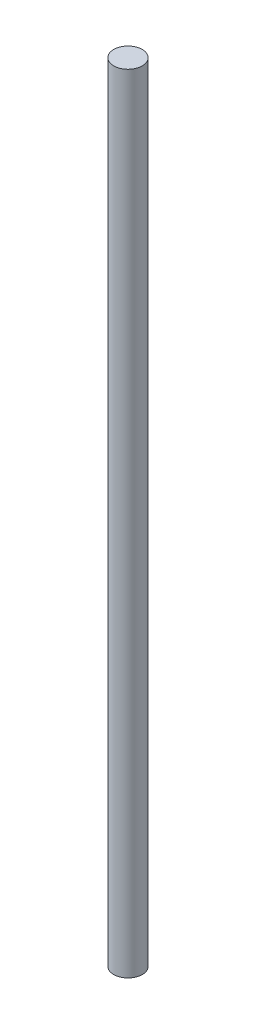
ISO-10303-21;
HEADER;
FILE_DESCRIPTION(('STEP AP214'),'2;1');
FILE_NAME('part.step','',(''),(''),'','','');
FILE_SCHEMA(('AUTOMOTIVE_DESIGN { 1 0 10303 214 1 1 1 1 }'));
ENDSEC;
DATA;
#1=APPLICATION_CONTEXT('core data for automotive mechanical design processes');
#2=APPLICATION_PROTOCOL_DEFINITION('international standard','automotive_design',2000,#1);
#3=PRODUCT_CONTEXT('',#1,'mechanical');
#4=PRODUCT('Part','Part','',(#3));
#5=PRODUCT_RELATED_PRODUCT_CATEGORY('part','',(#4));
#6=PRODUCT_DEFINITION_FORMATION('','',#4);
#7=PRODUCT_DEFINITION_CONTEXT('part definition',#1,'design');
#8=PRODUCT_DEFINITION('design','',#6,#7);
#9=PRODUCT_DEFINITION_SHAPE('','',#8);
#10=(LENGTH_UNIT() NAMED_UNIT(*) SI_UNIT(.MILLI.,.METRE.));
#11=(NAMED_UNIT(*) PLANE_ANGLE_UNIT() SI_UNIT($,.RADIAN.));
#12=(NAMED_UNIT(*) SI_UNIT($,.STERADIAN.) SOLID_ANGLE_UNIT());
#13=UNCERTAINTY_MEASURE_WITH_UNIT(LENGTH_MEASURE(1.E-05),#10,'distance_accuracy_value','');
#14=(GEOMETRIC_REPRESENTATION_CONTEXT(3) GLOBAL_UNCERTAINTY_ASSIGNED_CONTEXT((#13)) GLOBAL_UNIT_ASSIGNED_CONTEXT((#10,
#11,#12)) REPRESENTATION_CONTEXT('',''));
#15=CARTESIAN_POINT('',(0.,0.,0.));
#16=DIRECTION('',(0.,0.,1.));
#17=DIRECTION('',(1.,0.,0.));
#18=AXIS2_PLACEMENT_3D('',#15,#16,#17);
#19=CARTESIAN_POINT('',(0.,87.63,0.));
#20=DIRECTION('',(0.,-1.,0.));
#21=DIRECTION('',(0.,0.,-1.));
#22=AXIS2_PLACEMENT_3D('',#19,#20,#21);
#23=CYLINDRICAL_SURFACE('',#22,1.5875);
#24=CARTESIAN_POINT('',(0.,87.63,0.));
#25=DIRECTION('',(0.,1.,0.));
#26=DIRECTION('',(0.,0.,1.));
#27=AXIS2_PLACEMENT_3D('',#24,#25,#26);
#28=CIRCLE('',#27,1.5875);
#29=CARTESIAN_POINT('',(0.,87.63,1.5875));
#30=VERTEX_POINT('',#29);
#31=EDGE_CURVE('E10',#30,#30,#28,.T.);
#32=ORIENTED_EDGE('',*,*,#31,.F.);
#33=EDGE_LOOP('',(#32));
#34=FACE_BOUND('',#33,.T.);
#35=CARTESIAN_POINT('',(0.,0.,0.));
#36=DIRECTION('',(0.,1.,0.));
#37=DIRECTION('',(0.,0.,1.));
#38=AXIS2_PLACEMENT_3D('',#35,#36,#37);
#39=CIRCLE('',#38,1.5875);
#40=CARTESIAN_POINT('',(0.,0.,1.5875));
#41=VERTEX_POINT('',#40);
#42=EDGE_CURVE('E35',#41,#41,#39,.T.);
#43=ORIENTED_EDGE('',*,*,#42,.T.);
#44=EDGE_LOOP('',(#43));
#45=FACE_BOUND('',#44,.T.);
#46=ADVANCED_FACE('F32',(#34,#45),#23,.T.);
#47=CARTESIAN_POINT('',(0.,87.63,0.));
#48=DIRECTION('',(0.,1.,0.));
#49=DIRECTION('',(0.,0.,1.));
#50=AXIS2_PLACEMENT_3D('',#47,#48,#49);
#51=PLANE('',#50);
#52=ORIENTED_EDGE('',*,*,#31,.T.);
#53=EDGE_LOOP('',(#52));
#54=FACE_BOUND('',#53,.T.);
#55=ADVANCED_FACE('F47',(#54),#51,.T.);
#56=CARTESIAN_POINT('',(0.,0.,0.));
#57=DIRECTION('',(0.,1.,0.));
#58=DIRECTION('',(0.,0.,1.));
#59=AXIS2_PLACEMENT_3D('',#56,#57,#58);
#60=PLANE('',#59);
#61=ORIENTED_EDGE('',*,*,#42,.F.);
#62=EDGE_LOOP('',(#61));
#63=FACE_BOUND('',#62,.T.);
#64=ADVANCED_FACE('F45',(#63),#60,.F.);
#65=CLOSED_SHELL('',(#46,#55,#64));
#66=MANIFOLD_SOLID_BREP('B2',#65);
#67=ADVANCED_BREP_SHAPE_REPRESENTATION('',(#18,#66),#14);
#68=SHAPE_DEFINITION_REPRESENTATION(#9,#67);
ENDSEC;
END-ISO-10303-21;
